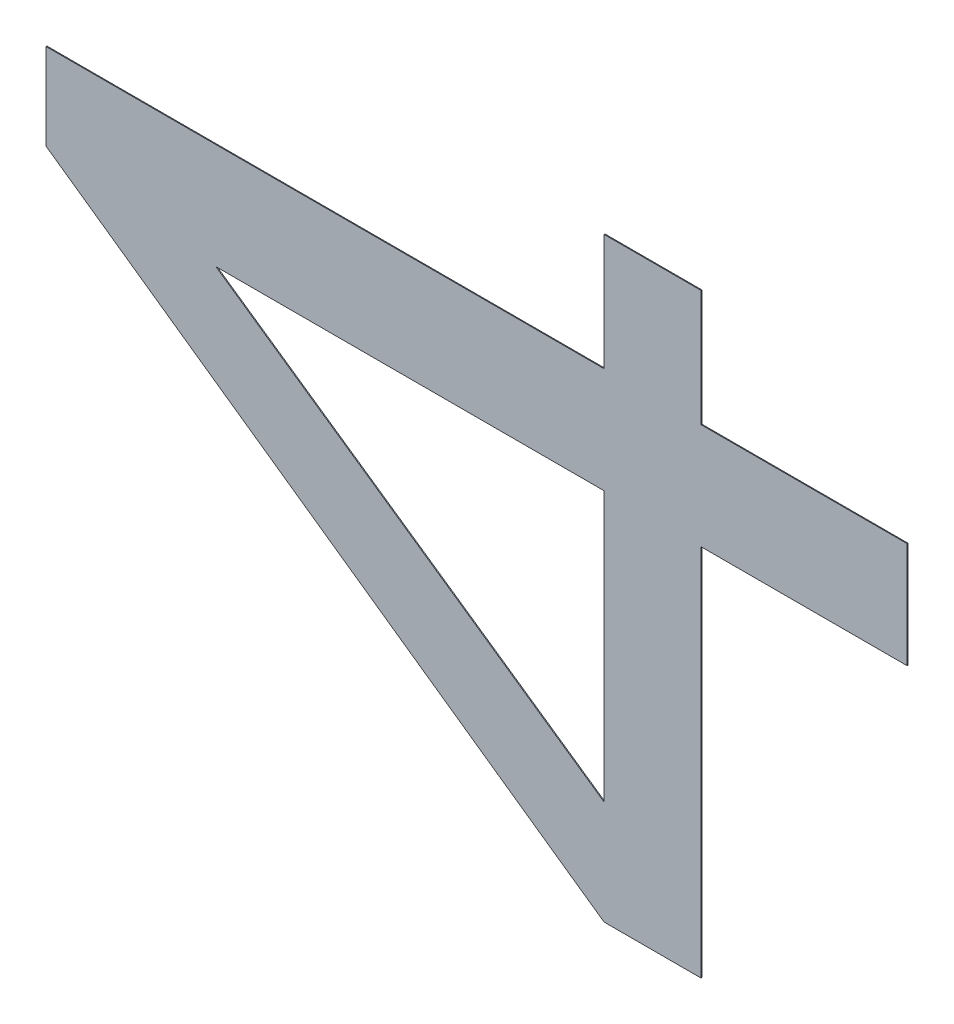
ISO-10303-21;
HEADER;
FILE_DESCRIPTION(('STEP AP214'),'2;1');
FILE_NAME('part.step','',(''),(''),'','','');
FILE_SCHEMA(('AUTOMOTIVE_DESIGN { 1 0 10303 214 1 1 1 1 }'));
ENDSEC;
DATA;
#1=APPLICATION_CONTEXT('core data for automotive mechanical design processes');
#2=APPLICATION_PROTOCOL_DEFINITION('international standard','automotive_design',2000,#1);
#3=PRODUCT_CONTEXT('',#1,'mechanical');
#4=PRODUCT('Part','Part','',(#3));
#5=PRODUCT_RELATED_PRODUCT_CATEGORY('part','',(#4));
#6=PRODUCT_DEFINITION_FORMATION('','',#4);
#7=PRODUCT_DEFINITION_CONTEXT('part definition',#1,'design');
#8=PRODUCT_DEFINITION('design','',#6,#7);
#9=PRODUCT_DEFINITION_SHAPE('','',#8);
#10=(LENGTH_UNIT() NAMED_UNIT(*) SI_UNIT(.MILLI.,.METRE.));
#11=(NAMED_UNIT(*) PLANE_ANGLE_UNIT() SI_UNIT($,.RADIAN.));
#12=(NAMED_UNIT(*) SI_UNIT($,.STERADIAN.) SOLID_ANGLE_UNIT());
#13=UNCERTAINTY_MEASURE_WITH_UNIT(LENGTH_MEASURE(1.E-05),#10,'distance_accuracy_value','');
#14=(GEOMETRIC_REPRESENTATION_CONTEXT(3) GLOBAL_UNCERTAINTY_ASSIGNED_CONTEXT((#13)) GLOBAL_UNIT_ASSIGNED_CONTEXT((#10,
#11,#12)) REPRESENTATION_CONTEXT('',''));
#15=CARTESIAN_POINT('',(0.,0.,0.));
#16=DIRECTION('',(0.,0.,1.));
#17=DIRECTION('',(1.,0.,0.));
#18=AXIS2_PLACEMENT_3D('',#15,#16,#17);
#19=CARTESIAN_POINT('',(100.494516063024,-44.7015960712095,0.002));
#20=DIRECTION('',(0.,1.,0.));
#21=DIRECTION('',(0.,0.,1.));
#22=AXIS2_PLACEMENT_3D('',#19,#20,#21);
#23=PLANE('',#22);
#24=CARTESIAN_POINT('',(100.494516063024,-44.7015960712095,0.));
#25=CARTESIAN_POINT('',(100.795041265944,-44.7015960712095,0.));
#26=CARTESIAN_POINT('',(101.095566468863,-44.7015960712095,0.));
#27=CARTESIAN_POINT('',(101.396091671782,-44.7015960712095,0.));
#28=B_SPLINE_CURVE_WITH_KNOTS('',3,(#24,#25,#26,#27),.UNSPECIFIED.,.F.,.F.,(4,4),(0.,
0.343404044009096),.UNSPECIFIED.);
#29=CARTESIAN_POINT('',(100.494516063024,-44.7015960712095,0.));
#30=VERTEX_POINT('',#29);
#31=CARTESIAN_POINT('',(101.396091671782,-44.7015960712095,0.));
#32=VERTEX_POINT('',#31);
#33=EDGE_CURVE('E125',#30,#32,#28,.T.);
#34=ORIENTED_EDGE('',*,*,#33,.T.);
#35=DIRECTION('',(0.,0.,-1.));
#36=VECTOR('',#35,1.);
#37=CARTESIAN_POINT('',(101.396091671782,-44.7015960712095,0.002));
#38=LINE('',#37,#36);
#39=CARTESIAN_POINT('',(101.396091671782,-44.7015960712095,0.002));
#40=VERTEX_POINT('',#39);
#41=EDGE_CURVE('E132',#40,#32,#38,.T.);
#42=ORIENTED_EDGE('',*,*,#41,.F.);
#43=CARTESIAN_POINT('',(100.494516063024,-44.7015960712095,0.002));
#44=CARTESIAN_POINT('',(100.795041265944,-44.7015960712095,0.002));
#45=CARTESIAN_POINT('',(101.095566468863,-44.7015960712095,0.002));
#46=CARTESIAN_POINT('',(101.396091671782,-44.7015960712095,0.002));
#47=B_SPLINE_CURVE_WITH_KNOTS('',3,(#43,#44,#45,#46),.UNSPECIFIED.,.F.,.F.,(4,4),(0.,
0.343404044009096),.UNSPECIFIED.);
#48=CARTESIAN_POINT('',(100.494516063024,-44.7015960712095,0.002));
#49=VERTEX_POINT('',#48);
#50=EDGE_CURVE('E137',#49,#40,#47,.T.);
#51=ORIENTED_EDGE('',*,*,#50,.F.);
#52=DIRECTION('',(0.,0.,-1.));
#53=VECTOR('',#52,1.);
#54=CARTESIAN_POINT('',(100.494516063024,-44.7015960712095,0.002));
#55=LINE('',#54,#53);
#56=EDGE_CURVE('E129',#49,#30,#55,.T.);
#57=ORIENTED_EDGE('',*,*,#56,.T.);
#58=EDGE_LOOP('',(#34,#42,#51,#57));
#59=FACE_BOUND('',#58,.T.);
#60=ADVANCED_FACE('F17',(#59),#23,.F.);
#61=CARTESIAN_POINT('',(101.396091671782,-44.7015960712095,0.002));
#62=DIRECTION('',(1.,0.,0.));
#63=DIRECTION('',(0.,0.,-1.));
#64=AXIS2_PLACEMENT_3D('',#61,#62,#63);
#65=PLANE('',#64);
#66=CARTESIAN_POINT('',(101.396091671782,-44.7015960712095,0.));
#67=CARTESIAN_POINT('',(101.396091671782,-44.9103130755066,0.));
#68=CARTESIAN_POINT('',(101.396091671782,-45.1190300798037,0.));
#69=CARTESIAN_POINT('',(101.396091671782,-45.3277470841008,0.));
#70=B_SPLINE_CURVE_WITH_KNOTS('',3,(#66,#67,#68,#69),.UNSPECIFIED.,.F.,.F.,(4,4),
(0.343404044009096,0.581900724596439),.UNSPECIFIED.);
#71=CARTESIAN_POINT('',(101.396091671782,-45.3277470841008,0.));
#72=VERTEX_POINT('',#71);
#73=EDGE_CURVE('E123',#32,#72,#70,.T.);
#74=ORIENTED_EDGE('',*,*,#73,.T.);
#75=DIRECTION('',(0.,0.,-1.));
#76=VECTOR('',#75,1.);
#77=CARTESIAN_POINT('',(101.396091671782,-45.3277470841008,0.002));
#78=LINE('',#77,#76);
#79=CARTESIAN_POINT('',(101.396091671782,-45.3277470841008,0.002));
#80=VERTEX_POINT('',#79);
#81=EDGE_CURVE('E128',#80,#72,#78,.T.);
#82=ORIENTED_EDGE('',*,*,#81,.F.);
#83=CARTESIAN_POINT('',(101.396091671782,-44.7015960712095,0.002));
#84=CARTESIAN_POINT('',(101.396091671782,-44.9103130755066,0.002));
#85=CARTESIAN_POINT('',(101.396091671782,-45.1190300798037,0.002));
#86=CARTESIAN_POINT('',(101.396091671782,-45.3277470841008,0.002));
#87=B_SPLINE_CURVE_WITH_KNOTS('',3,(#83,#84,#85,#86),.UNSPECIFIED.,.F.,.F.,(4,4),
(0.343404044009096,0.581900724596439),.UNSPECIFIED.);
#88=EDGE_CURVE('E117',#40,#80,#87,.T.);
#89=ORIENTED_EDGE('',*,*,#88,.F.);
#90=ORIENTED_EDGE('',*,*,#41,.T.);
#91=EDGE_LOOP('',(#74,#82,#89,#90));
#92=FACE_BOUND('',#91,.T.);
#93=ADVANCED_FACE('F133',(#92),#65,.F.);
#94=CARTESIAN_POINT('',(101.621178637201,-44.7015960712095,0.002));
#95=DIRECTION('',(0.,1.,0.));
#96=DIRECTION('',(0.,0.,1.));
#97=AXIS2_PLACEMENT_3D('',#94,#95,#96);
#98=PLANE('',#97);
#99=CARTESIAN_POINT('',(101.621178637201,-44.7015960712095,0.));
#100=CARTESIAN_POINT('',(101.780785758134,-44.7015960712095,0.));
#101=CARTESIAN_POINT('',(101.940392879067,-44.7015960712095,0.));
#102=CARTESIAN_POINT('',(102.1,-44.7015960712095,0.));
#103=B_SPLINE_CURVE_WITH_KNOTS('',3,(#99,#100,#101,#102),.UNSPECIFIED.,.F.,.F.,(4,4),(0.,
0.0779462514461247),.UNSPECIFIED.);
#104=CARTESIAN_POINT('',(101.621178637201,-44.7015960712095,0.));
#105=VERTEX_POINT('',#104);
#106=CARTESIAN_POINT('',(102.1,-44.7015960712095,0.));
#107=VERTEX_POINT('',#106);
#108=EDGE_CURVE('E175',#105,#107,#103,.T.);
#109=ORIENTED_EDGE('',*,*,#108,.T.);
#110=DIRECTION('',(0.,0.,-1.));
#111=VECTOR('',#110,1.);
#112=CARTESIAN_POINT('',(102.1,-44.7015960712095,0.002));
#113=LINE('',#112,#111);
#114=CARTESIAN_POINT('',(102.1,-44.7015960712095,0.002));
#115=VERTEX_POINT('',#114);
#116=EDGE_CURVE('E186',#115,#107,#113,.T.);
#117=ORIENTED_EDGE('',*,*,#116,.F.);
#118=CARTESIAN_POINT('',(101.621178637201,-44.7015960712095,0.002));
#119=CARTESIAN_POINT('',(101.780785758134,-44.7015960712095,0.002));
#120=CARTESIAN_POINT('',(101.940392879067,-44.7015960712095,0.002));
#121=CARTESIAN_POINT('',(102.1,-44.7015960712095,0.002));
#122=B_SPLINE_CURVE_WITH_KNOTS('',3,(#118,#119,#120,#121),.UNSPECIFIED.,.F.,.F.,(4,4),(0.,
0.0779462514461247),.UNSPECIFIED.);
#123=CARTESIAN_POINT('',(101.621178637201,-44.7015960712095,0.002));
#124=VERTEX_POINT('',#123);
#125=EDGE_CURVE('E190',#124,#115,#122,.T.);
#126=ORIENTED_EDGE('',*,*,#125,.F.);
#127=DIRECTION('',(0.,0.,-1.));
#128=VECTOR('',#127,1.);
#129=CARTESIAN_POINT('',(101.621178637201,-44.7015960712095,0.002));
#130=LINE('',#129,#128);
#131=EDGE_CURVE('E201',#124,#105,#130,.T.);
#132=ORIENTED_EDGE('',*,*,#131,.T.);
#133=EDGE_LOOP('',(#109,#117,#126,#132));
#134=FACE_BOUND('',#133,.T.);
#135=ADVANCED_FACE('F476',(#134),#98,.F.);
#136=CARTESIAN_POINT('',(102.1,-44.7015960712095,0.002));
#137=DIRECTION('',(-1.,0.,0.));
#138=DIRECTION('',(0.,0.,1.));
#139=AXIS2_PLACEMENT_3D('',#136,#137,#138);
#140=PLANE('',#139);
#141=CARTESIAN_POINT('',(102.1,-44.7015960712095,0.));
#142=CARTESIAN_POINT('',(102.1,-44.6197462656027,0.));
#143=CARTESIAN_POINT('',(102.1,-44.537896459996,0.));
#144=CARTESIAN_POINT('',(102.1,-44.4560466543893,0.));
#145=B_SPLINE_CURVE_WITH_KNOTS('',3,(#141,#142,#143,#144),.UNSPECIFIED.,.F.,.F.,(4,4),
(0.0779462514461247,0.117918688085163),.UNSPECIFIED.);
#146=CARTESIAN_POINT('',(102.1,-44.4560466543893,0.));
#147=VERTEX_POINT('',#146);
#148=EDGE_CURVE('E205',#107,#147,#145,.T.);
#149=ORIENTED_EDGE('',*,*,#148,.T.);
#150=DIRECTION('',(0.,0.,-1.));
#151=VECTOR('',#150,1.);
#152=CARTESIAN_POINT('',(102.1,-44.4560466543893,0.002));
#153=LINE('',#152,#151);
#154=CARTESIAN_POINT('',(102.1,-44.4560466543893,0.002));
#155=VERTEX_POINT('',#154);
#156=EDGE_CURVE('E215',#155,#147,#153,.T.);
#157=ORIENTED_EDGE('',*,*,#156,.F.);
#158=CARTESIAN_POINT('',(102.1,-44.7015960712095,0.002));
#159=CARTESIAN_POINT('',(102.1,-44.6197462656027,0.002));
#160=CARTESIAN_POINT('',(102.1,-44.537896459996,0.002));
#161=CARTESIAN_POINT('',(102.1,-44.4560466543893,0.002));
#162=B_SPLINE_CURVE_WITH_KNOTS('',3,(#158,#159,#160,#161),.UNSPECIFIED.,.F.,.F.,(4,4),
(0.0779462514461247,0.117918688085163),.UNSPECIFIED.);
#163=EDGE_CURVE('E219',#115,#155,#162,.T.);
#164=ORIENTED_EDGE('',*,*,#163,.F.);
#165=ORIENTED_EDGE('',*,*,#116,.T.);
#166=EDGE_LOOP('',(#149,#157,#164,#165));
#167=FACE_BOUND('',#166,.T.);
#168=ADVANCED_FACE('F481',(#167),#140,.F.);
#169=CARTESIAN_POINT('',(102.1,-44.4560466543893,0.002));
#170=DIRECTION('',(0.,-1.,0.));
#171=DIRECTION('',(0.,0.,-1.));
#172=AXIS2_PLACEMENT_3D('',#169,#170,#171);
#173=PLANE('',#172);
#174=CARTESIAN_POINT('',(102.1,-44.4560466543893,0.));
#175=CARTESIAN_POINT('',(101.940392879067,-44.4560466543893,0.));
#176=CARTESIAN_POINT('',(101.780785758134,-44.4560466543893,0.));
#177=CARTESIAN_POINT('',(101.621178637201,-44.4560466543893,0.));
#178=B_SPLINE_CURVE_WITH_KNOTS('',3,(#174,#175,#176,#177),.UNSPECIFIED.,.F.,.F.,(4,4),
(0.117918688085163,0.195864939531288),.UNSPECIFIED.);
#179=CARTESIAN_POINT('',(101.621178637201,-44.4560466543893,0.));
#180=VERTEX_POINT('',#179);
#181=EDGE_CURVE('E229',#147,#180,#178,.T.);
#182=ORIENTED_EDGE('',*,*,#181,.T.);
#183=DIRECTION('',(0.,0.,-1.));
#184=VECTOR('',#183,1.);
#185=CARTESIAN_POINT('',(101.621178637201,-44.4560466543893,0.002));
#186=LINE('',#185,#184);
#187=CARTESIAN_POINT('',(101.621178637201,-44.4560466543893,0.002));
#188=VERTEX_POINT('',#187);
#189=EDGE_CURVE('E239',#188,#180,#186,.T.);
#190=ORIENTED_EDGE('',*,*,#189,.F.);
#191=CARTESIAN_POINT('',(102.1,-44.4560466543893,0.002));
#192=CARTESIAN_POINT('',(101.940392879067,-44.4560466543893,0.002));
#193=CARTESIAN_POINT('',(101.780785758134,-44.4560466543893,0.002));
#194=CARTESIAN_POINT('',(101.621178637201,-44.4560466543893,0.002));
#195=B_SPLINE_CURVE_WITH_KNOTS('',3,(#191,#192,#193,#194),.UNSPECIFIED.,.F.,.F.,(4,4),
(0.117918688085163,0.195864939531288),.UNSPECIFIED.);
#196=EDGE_CURVE('E243',#155,#188,#195,.T.);
#197=ORIENTED_EDGE('',*,*,#196,.F.);
#198=ORIENTED_EDGE('',*,*,#156,.T.);
#199=EDGE_LOOP('',(#182,#190,#197,#198));
#200=FACE_BOUND('',#199,.T.);
#201=ADVANCED_FACE('F485',(#200),#173,.F.);
#202=CARTESIAN_POINT('',(101.621178637201,-44.4560466543893,0.002));
#203=DIRECTION('',(-1.,0.,0.));
#204=DIRECTION('',(0.,0.,1.));
#205=AXIS2_PLACEMENT_3D('',#202,#203,#204);
#206=PLANE('',#205);
#207=CARTESIAN_POINT('',(101.621178637201,-44.4560466543893,0.));
#208=CARTESIAN_POINT('',(101.621178637201,-44.3660118682219,0.));
#209=CARTESIAN_POINT('',(101.621178637201,-44.2759770820546,0.));
#210=CARTESIAN_POINT('',(101.621178637201,-44.1859422958872,0.));
#211=B_SPLINE_CURVE_WITH_KNOTS('',3,(#207,#208,#209,#210),.UNSPECIFIED.,.F.,.F.,(4,4),
(0.195864939531288,0.239834619834229),.UNSPECIFIED.);
#212=CARTESIAN_POINT('',(101.621178637201,-44.1859422958872,0.));
#213=VERTEX_POINT('',#212);
#214=EDGE_CURVE('E253',#180,#213,#211,.T.);
#215=ORIENTED_EDGE('',*,*,#214,.T.);
#216=DIRECTION('',(0.,0.,-1.));
#217=VECTOR('',#216,1.);
#218=CARTESIAN_POINT('',(101.621178637201,-44.1859422958872,0.002));
#219=LINE('',#218,#217);
#220=CARTESIAN_POINT('',(101.621178637201,-44.1859422958872,0.002));
#221=VERTEX_POINT('',#220);
#222=EDGE_CURVE('E263',#221,#213,#219,.T.);
#223=ORIENTED_EDGE('',*,*,#222,.F.);
#224=CARTESIAN_POINT('',(101.621178637201,-44.4560466543893,0.002));
#225=CARTESIAN_POINT('',(101.621178637201,-44.3660118682219,0.002));
#226=CARTESIAN_POINT('',(101.621178637201,-44.2759770820546,0.002));
#227=CARTESIAN_POINT('',(101.621178637201,-44.1859422958872,0.002));
#228=B_SPLINE_CURVE_WITH_KNOTS('',3,(#224,#225,#226,#227),.UNSPECIFIED.,.F.,.F.,(4,4),
(0.195864939531288,0.239834619834229),.UNSPECIFIED.);
#229=EDGE_CURVE('E267',#188,#221,#228,.T.);
#230=ORIENTED_EDGE('',*,*,#229,.F.);
#231=ORIENTED_EDGE('',*,*,#189,.T.);
#232=EDGE_LOOP('',(#215,#223,#230,#231));
#233=FACE_BOUND('',#232,.T.);
#234=ADVANCED_FACE('F489',(#233),#206,.F.);
#235=CARTESIAN_POINT('',(101.621178637201,-44.1859422958872,0.002));
#236=DIRECTION('',(0.,-1.,0.));
#237=DIRECTION('',(0.,0.,-1.));
#238=AXIS2_PLACEMENT_3D('',#235,#236,#237);
#239=PLANE('',#238);
#240=CARTESIAN_POINT('',(101.621178637201,-44.1859422958872,0.));
#241=CARTESIAN_POINT('',(101.546149648728,-44.1859422958872,0.));
#242=CARTESIAN_POINT('',(101.471120660255,-44.1859422958872,0.));
#243=CARTESIAN_POINT('',(101.396091671782,-44.1859422958872,0.));
#244=B_SPLINE_CURVE_WITH_KNOTS('',3,(#240,#241,#242,#243),.UNSPECIFIED.,.F.,.F.,(4,4),
(0.239834619834229,0.27647602008668),.UNSPECIFIED.);
#245=CARTESIAN_POINT('',(101.396091671782,-44.1859422958872,0.));
#246=VERTEX_POINT('',#245);
#247=EDGE_CURVE('E277',#213,#246,#244,.T.);
#248=ORIENTED_EDGE('',*,*,#247,.T.);
#249=DIRECTION('',(0.,0.,-1.));
#250=VECTOR('',#249,1.);
#251=CARTESIAN_POINT('',(101.396091671782,-44.1859422958872,0.002));
#252=LINE('',#251,#250);
#253=CARTESIAN_POINT('',(101.396091671782,-44.1859422958872,0.002));
#254=VERTEX_POINT('',#253);
#255=EDGE_CURVE('E287',#254,#246,#252,.T.);
#256=ORIENTED_EDGE('',*,*,#255,.F.);
#257=CARTESIAN_POINT('',(101.621178637201,-44.1859422958872,0.002));
#258=CARTESIAN_POINT('',(101.546149648728,-44.1859422958872,0.002));
#259=CARTESIAN_POINT('',(101.471120660255,-44.1859422958872,0.002));
#260=CARTESIAN_POINT('',(101.396091671782,-44.1859422958872,0.002));
#261=B_SPLINE_CURVE_WITH_KNOTS('',3,(#257,#258,#259,#260),.UNSPECIFIED.,.F.,.F.,(4,4),
(0.239834619834229,0.27647602008668),.UNSPECIFIED.);
#262=EDGE_CURVE('E291',#221,#254,#261,.T.);
#263=ORIENTED_EDGE('',*,*,#262,.F.);
#264=ORIENTED_EDGE('',*,*,#222,.T.);
#265=EDGE_LOOP('',(#248,#256,#263,#264));
#266=FACE_BOUND('',#265,.T.);
#267=ADVANCED_FACE('F493',(#266),#239,.F.);
#268=CARTESIAN_POINT('',(101.396091671782,-44.1859422958872,0.002));
#269=DIRECTION('',(1.,0.,0.));
#270=DIRECTION('',(0.,0.,-1.));
#271=AXIS2_PLACEMENT_3D('',#268,#269,#270);
#272=PLANE('',#271);
#273=CARTESIAN_POINT('',(101.396091671782,-44.1859422958872,0.));
#274=CARTESIAN_POINT('',(101.396091671782,-44.2759770820546,0.));
#275=CARTESIAN_POINT('',(101.396091671782,-44.3660118682219,0.));
#276=CARTESIAN_POINT('',(101.396091671782,-44.4560466543893,0.));
#277=B_SPLINE_CURVE_WITH_KNOTS('',3,(#273,#274,#275,#276),.UNSPECIFIED.,.F.,.F.,(4,4),
(0.27647602008668,0.320445700389623),.UNSPECIFIED.);
#278=CARTESIAN_POINT('',(101.396091671782,-44.4560466543893,0.));
#279=VERTEX_POINT('',#278);
#280=EDGE_CURVE('E301',#246,#279,#277,.T.);
#281=ORIENTED_EDGE('',*,*,#280,.T.);
#282=DIRECTION('',(0.,0.,-1.));
#283=VECTOR('',#282,1.);
#284=CARTESIAN_POINT('',(101.396091671782,-44.4560466543893,0.002));
#285=LINE('',#284,#283);
#286=CARTESIAN_POINT('',(101.396091671782,-44.4560466543893,0.002));
#287=VERTEX_POINT('',#286);
#288=EDGE_CURVE('E311',#287,#279,#285,.T.);
#289=ORIENTED_EDGE('',*,*,#288,.F.);
#290=CARTESIAN_POINT('',(101.396091671782,-44.1859422958872,0.002));
#291=CARTESIAN_POINT('',(101.396091671782,-44.2759770820546,0.002));
#292=CARTESIAN_POINT('',(101.396091671782,-44.3660118682219,0.002));
#293=CARTESIAN_POINT('',(101.396091671782,-44.4560466543893,0.002));
#294=B_SPLINE_CURVE_WITH_KNOTS('',3,(#290,#291,#292,#293),.UNSPECIFIED.,.F.,.F.,(4,4),
(0.27647602008668,0.320445700389623),.UNSPECIFIED.);
#295=EDGE_CURVE('E315',#254,#287,#294,.T.);
#296=ORIENTED_EDGE('',*,*,#295,.F.);
#297=ORIENTED_EDGE('',*,*,#255,.T.);
#298=EDGE_LOOP('',(#281,#289,#296,#297));
#299=FACE_BOUND('',#298,.T.);
#300=ADVANCED_FACE('F497',(#299),#272,.F.);
#301=CARTESIAN_POINT('',(101.396091671782,-44.4560466543893,0.002));
#302=DIRECTION('',(0.,-1.,0.));
#303=DIRECTION('',(0.,0.,-1.));
#304=AXIS2_PLACEMENT_3D('',#301,#302,#303);
#305=PLANE('',#304);
#306=CARTESIAN_POINT('',(101.396091671782,-44.4560466543893,0.));
#307=CARTESIAN_POINT('',(100.964061114521,-44.4560466543893,0.));
#308=CARTESIAN_POINT('',(100.532030557261,-44.4560466543893,0.));
#309=CARTESIAN_POINT('',(100.1,-44.4560466543893,0.));
#310=B_SPLINE_CURVE_WITH_KNOTS('',3,(#306,#307,#308,#309),.UNSPECIFIED.,.F.,.F.,(4,4),
(0.320445700389623,0.531433545116012),.UNSPECIFIED.);
#311=CARTESIAN_POINT('',(100.1,-44.4560466543893,0.));
#312=VERTEX_POINT('',#311);
#313=EDGE_CURVE('E325',#279,#312,#310,.T.);
#314=ORIENTED_EDGE('',*,*,#313,.T.);
#315=DIRECTION('',(0.,0.,-1.));
#316=VECTOR('',#315,1.);
#317=CARTESIAN_POINT('',(100.1,-44.4560466543893,0.002));
#318=LINE('',#317,#316);
#319=CARTESIAN_POINT('',(100.1,-44.4560466543893,0.002));
#320=VERTEX_POINT('',#319);
#321=EDGE_CURVE('E335',#320,#312,#318,.T.);
#322=ORIENTED_EDGE('',*,*,#321,.F.);
#323=CARTESIAN_POINT('',(101.396091671782,-44.4560466543893,0.002));
#324=CARTESIAN_POINT('',(100.964061114521,-44.4560466543893,0.002));
#325=CARTESIAN_POINT('',(100.532030557261,-44.4560466543893,0.002));
#326=CARTESIAN_POINT('',(100.1,-44.4560466543893,0.002));
#327=B_SPLINE_CURVE_WITH_KNOTS('',3,(#323,#324,#325,#326),.UNSPECIFIED.,.F.,.F.,(4,4),
(0.320445700389623,0.531433545116012),.UNSPECIFIED.);
#328=EDGE_CURVE('E339',#287,#320,#327,.T.);
#329=ORIENTED_EDGE('',*,*,#328,.F.);
#330=ORIENTED_EDGE('',*,*,#288,.T.);
#331=EDGE_LOOP('',(#314,#322,#329,#330));
#332=FACE_BOUND('',#331,.T.);
#333=ADVANCED_FACE('F501',(#332),#305,.F.);
#334=CARTESIAN_POINT('',(100.1,-44.4560466543893,0.002));
#335=DIRECTION('',(1.,0.,0.));
#336=DIRECTION('',(0.,0.,-1.));
#337=AXIS2_PLACEMENT_3D('',#334,#335,#336);
#338=PLANE('',#337);
#339=CARTESIAN_POINT('',(100.1,-44.4560466543893,0.));
#340=CARTESIAN_POINT('',(100.1,-44.5228906623014,0.));
#341=CARTESIAN_POINT('',(100.1,-44.5897346702136,0.));
#342=CARTESIAN_POINT('',(100.1,-44.6565786781258,0.));
#343=B_SPLINE_CURVE_WITH_KNOTS('',3,(#339,#340,#341,#342),.UNSPECIFIED.,.F.,.F.,(4,4),
(0.531433545116012,0.56407770170456),.UNSPECIFIED.);
#344=CARTESIAN_POINT('',(100.1,-44.6565786781258,0.));
#345=VERTEX_POINT('',#344);
#346=EDGE_CURVE('E349',#312,#345,#343,.T.);
#347=ORIENTED_EDGE('',*,*,#346,.T.);
#348=DIRECTION('',(0.,0.,-1.));
#349=VECTOR('',#348,1.);
#350=CARTESIAN_POINT('',(100.1,-44.6565786781258,0.002));
#351=LINE('',#350,#349);
#352=CARTESIAN_POINT('',(100.1,-44.6565786781258,0.002));
#353=VERTEX_POINT('',#352);
#354=EDGE_CURVE('E359',#353,#345,#351,.T.);
#355=ORIENTED_EDGE('',*,*,#354,.F.);
#356=CARTESIAN_POINT('',(100.1,-44.4560466543893,0.002));
#357=CARTESIAN_POINT('',(100.1,-44.5228906623014,0.002));
#358=CARTESIAN_POINT('',(100.1,-44.5897346702136,0.002));
#359=CARTESIAN_POINT('',(100.1,-44.6565786781258,0.002));
#360=B_SPLINE_CURVE_WITH_KNOTS('',3,(#356,#357,#358,#359),.UNSPECIFIED.,.F.,.F.,(4,4),
(0.531433545116012,0.56407770170456),.UNSPECIFIED.);
#361=EDGE_CURVE('E363',#320,#353,#360,.T.);
#362=ORIENTED_EDGE('',*,*,#361,.F.);
#363=ORIENTED_EDGE('',*,*,#321,.T.);
#364=EDGE_LOOP('',(#347,#355,#362,#363));
#365=FACE_BOUND('',#364,.T.);
#366=ADVANCED_FACE('F505',(#365),#338,.F.);
#367=CARTESIAN_POINT('',(100.1,-44.6565786781258,0.002));
#368=DIRECTION('',(0.575730002924625,0.817639874108651,0.));
#369=DIRECTION('',(-0.817639874108651,0.575730002924626,0.));
#370=AXIS2_PLACEMENT_3D('',#367,#368,#369);
#371=PLANE('',#370);
#372=CARTESIAN_POINT('',(100.1,-44.6565786781258,0.));
#373=CARTESIAN_POINT('',(100.532030557261,-44.9607871222974,0.));
#374=CARTESIAN_POINT('',(100.964061114521,-45.264995566469,0.));
#375=CARTESIAN_POINT('',(101.396091671782,-45.5692040106406,0.));
#376=B_SPLINE_CURVE_WITH_KNOTS('',3,(#372,#373,#374,#375),.UNSPECIFIED.,.F.,.F.,(4,4),
(0.56407770170456,0.822122656956281),.UNSPECIFIED.);
#377=CARTESIAN_POINT('',(101.396091671782,-45.5692040106406,0.));
#378=VERTEX_POINT('',#377);
#379=EDGE_CURVE('E373',#345,#378,#376,.T.);
#380=ORIENTED_EDGE('',*,*,#379,.T.);
#381=DIRECTION('',(0.,0.,-1.));
#382=VECTOR('',#381,1.);
#383=CARTESIAN_POINT('',(101.396091671782,-45.5692040106406,0.002));
#384=LINE('',#383,#382);
#385=CARTESIAN_POINT('',(101.396091671782,-45.5692040106406,0.002));
#386=VERTEX_POINT('',#385);
#387=EDGE_CURVE('E383',#386,#378,#384,.T.);
#388=ORIENTED_EDGE('',*,*,#387,.F.);
#389=CARTESIAN_POINT('',(100.1,-44.6565786781258,0.002));
#390=CARTESIAN_POINT('',(100.532030557261,-44.9607871222974,0.002));
#391=CARTESIAN_POINT('',(100.964061114521,-45.264995566469,0.002));
#392=CARTESIAN_POINT('',(101.396091671782,-45.5692040106406,0.002));
#393=B_SPLINE_CURVE_WITH_KNOTS('',3,(#389,#390,#391,#392),.UNSPECIFIED.,.F.,.F.,(4,4),
(0.56407770170456,0.822122656956281),.UNSPECIFIED.);
#394=EDGE_CURVE('E387',#353,#386,#393,.T.);
#395=ORIENTED_EDGE('',*,*,#394,.F.);
#396=ORIENTED_EDGE('',*,*,#354,.T.);
#397=EDGE_LOOP('',(#380,#388,#395,#396));
#398=FACE_BOUND('',#397,.T.);
#399=ADVANCED_FACE('F509',(#398),#371,.F.);
#400=CARTESIAN_POINT('',(101.396091671782,-45.5692040106406,0.002));
#401=DIRECTION('',(0.,1.,0.));
#402=DIRECTION('',(0.,0.,1.));
#403=AXIS2_PLACEMENT_3D('',#400,#401,#402);
#404=PLANE('',#403);
#405=CARTESIAN_POINT('',(101.396091671782,-45.5692040106406,0.));
#406=CARTESIAN_POINT('',(101.471120660255,-45.5692040106406,0.));
#407=CARTESIAN_POINT('',(101.546149648728,-45.5692040106406,0.));
#408=CARTESIAN_POINT('',(101.621178637201,-45.5692040106406,0.));
#409=B_SPLINE_CURVE_WITH_KNOTS('',3,(#405,#406,#407,#408),.UNSPECIFIED.,.F.,.F.,(4,4),
(0.822122656956281,0.858764057208732),.UNSPECIFIED.);
#410=CARTESIAN_POINT('',(101.621178637201,-45.5692040106406,0.));
#411=VERTEX_POINT('',#410);
#412=EDGE_CURVE('E397',#378,#411,#409,.T.);
#413=ORIENTED_EDGE('',*,*,#412,.T.);
#414=DIRECTION('',(0.,0.,-1.));
#415=VECTOR('',#414,1.);
#416=CARTESIAN_POINT('',(101.621178637201,-45.5692040106406,0.002));
#417=LINE('',#416,#415);
#418=CARTESIAN_POINT('',(101.621178637201,-45.5692040106406,0.002));
#419=VERTEX_POINT('',#418);
#420=EDGE_CURVE('E407',#419,#411,#417,.T.);
#421=ORIENTED_EDGE('',*,*,#420,.F.);
#422=CARTESIAN_POINT('',(101.396091671782,-45.5692040106406,0.002));
#423=CARTESIAN_POINT('',(101.471120660255,-45.5692040106406,0.002));
#424=CARTESIAN_POINT('',(101.546149648728,-45.5692040106406,0.002));
#425=CARTESIAN_POINT('',(101.621178637201,-45.5692040106406,0.002));
#426=B_SPLINE_CURVE_WITH_KNOTS('',3,(#422,#423,#424,#425),.UNSPECIFIED.,.F.,.F.,(4,4),
(0.822122656956281,0.858764057208732),.UNSPECIFIED.);
#427=EDGE_CURVE('E39',#386,#419,#426,.T.);
#428=ORIENTED_EDGE('',*,*,#427,.F.);
#429=ORIENTED_EDGE('',*,*,#387,.T.);
#430=EDGE_LOOP('',(#413,#421,#428,#429));
#431=FACE_BOUND('',#430,.T.);
#432=ADVANCED_FACE('F513',(#431),#404,.F.);
#433=CARTESIAN_POINT('',(101.621178637201,-45.5692040106406,0.002));
#434=DIRECTION('',(-1.,0.,0.));
#435=DIRECTION('',(0.,0.,1.));
#436=AXIS2_PLACEMENT_3D('',#433,#434,#435);
#437=PLANE('',#436);
#438=CARTESIAN_POINT('',(101.621178637201,-45.5692040106406,0.));
#439=CARTESIAN_POINT('',(101.621178637201,-45.2800013641636,0.));
#440=CARTESIAN_POINT('',(101.621178637201,-44.9907987176865,0.));
#441=CARTESIAN_POINT('',(101.621178637201,-44.7015960712095,0.));
#442=B_SPLINE_CURVE_WITH_KNOTS('',3,(#438,#439,#440,#441),.UNSPECIFIED.,.F.,.F.,(4,4),
(0.858764057208732,1.),.UNSPECIFIED.);
#443=EDGE_CURVE('E420',#411,#105,#442,.T.);
#444=ORIENTED_EDGE('',*,*,#443,.T.);
#445=ORIENTED_EDGE('',*,*,#131,.F.);
#446=CARTESIAN_POINT('',(101.621178637201,-45.5692040106406,0.002));
#447=CARTESIAN_POINT('',(101.621178637201,-45.2800013641636,0.002));
#448=CARTESIAN_POINT('',(101.621178637201,-44.9907987176865,0.002));
#449=CARTESIAN_POINT('',(101.621178637201,-44.7015960712095,0.002));
#450=B_SPLINE_CURVE_WITH_KNOTS('',3,(#446,#447,#448,#449),.UNSPECIFIED.,.F.,.F.,(4,4),
(0.858764057208732,1.),.UNSPECIFIED.);
#451=EDGE_CURVE('E430',#419,#124,#450,.T.);
#452=ORIENTED_EDGE('',*,*,#451,.F.);
#453=ORIENTED_EDGE('',*,*,#420,.T.);
#454=EDGE_LOOP('',(#444,#445,#452,#453));
#455=FACE_BOUND('',#454,.T.);
#456=ADVANCED_FACE('F469',(#455),#437,.F.);
#457=CARTESIAN_POINT('',(101.396091671782,-45.3277470841008,0.002));
#458=DIRECTION('',(-0.570430743648483,-0.821345704743525,0.));
#459=DIRECTION('',(0.821345704743525,-0.570430743648484,0.));
#460=AXIS2_PLACEMENT_3D('',#457,#458,#459);
#461=PLANE('',#460);
#462=CARTESIAN_POINT('',(101.396091671782,-45.3277470841008,0.));
#463=CARTESIAN_POINT('',(101.095566468863,-45.1190300798037,0.));
#464=CARTESIAN_POINT('',(100.795041265944,-44.9103130755066,0.));
#465=CARTESIAN_POINT('',(100.494516063024,-44.7015960712095,0.));
#466=B_SPLINE_CURVE_WITH_KNOTS('',3,(#462,#463,#464,#465),.UNSPECIFIED.,.F.,.F.,(4,4),
(0.581900724596439,1.),.UNSPECIFIED.);
#467=EDGE_CURVE('E30',#72,#30,#466,.T.);
#468=ORIENTED_EDGE('',*,*,#467,.T.);
#469=ORIENTED_EDGE('',*,*,#56,.F.);
#470=CARTESIAN_POINT('',(101.396091671782,-45.3277470841008,0.002));
#471=CARTESIAN_POINT('',(101.095566468863,-45.1190300798037,0.002));
#472=CARTESIAN_POINT('',(100.795041265944,-44.9103130755066,0.002));
#473=CARTESIAN_POINT('',(100.494516063024,-44.7015960712095,0.002));
#474=B_SPLINE_CURVE_WITH_KNOTS('',3,(#470,#471,#472,#473),.UNSPECIFIED.,.F.,.F.,(4,4),
(0.581900724596439,1.),.UNSPECIFIED.);
#475=EDGE_CURVE('E11',#80,#49,#474,.T.);
#476=ORIENTED_EDGE('',*,*,#475,.F.);
#477=ORIENTED_EDGE('',*,*,#81,.T.);
#478=EDGE_LOOP('',(#468,#469,#476,#477));
#479=FACE_BOUND('',#478,.T.);
#480=ADVANCED_FACE('F458',(#479),#461,.F.);
#481=CARTESIAN_POINT('',(101.8605893186,-44.7015960712095,0.002));
#482=DIRECTION('',(0.,0.,-1.));
#483=DIRECTION('',(-1.,0.,0.));
#484=AXIS2_PLACEMENT_3D('',#481,#482,#483);
#485=PLANE('',#484);
#486=ORIENTED_EDGE('',*,*,#125,.T.);
#487=ORIENTED_EDGE('',*,*,#163,.T.);
#488=ORIENTED_EDGE('',*,*,#196,.T.);
#489=ORIENTED_EDGE('',*,*,#229,.T.);
#490=ORIENTED_EDGE('',*,*,#262,.T.);
#491=ORIENTED_EDGE('',*,*,#295,.T.);
#492=ORIENTED_EDGE('',*,*,#328,.T.);
#493=ORIENTED_EDGE('',*,*,#361,.T.);
#494=ORIENTED_EDGE('',*,*,#394,.T.);
#495=ORIENTED_EDGE('',*,*,#427,.T.);
#496=ORIENTED_EDGE('',*,*,#451,.T.);
#497=EDGE_LOOP('',(#486,#487,#488,#489,#490,#491,#492,#493,#494,#495,#496));
#498=FACE_BOUND('',#497,.T.);
#499=ORIENTED_EDGE('',*,*,#50,.T.);
#500=ORIENTED_EDGE('',*,*,#88,.T.);
#501=ORIENTED_EDGE('',*,*,#475,.T.);
#502=EDGE_LOOP('',(#499,#500,#501));
#503=FACE_BOUND('',#502,.T.);
#504=ADVANCED_FACE('F461',(#498,#503),#485,.F.);
#505=CARTESIAN_POINT('',(101.8605893186,-44.7015960712095,0.));
#506=DIRECTION('',(0.,0.,-1.));
#507=DIRECTION('',(-1.,0.,0.));
#508=AXIS2_PLACEMENT_3D('',#505,#506,#507);
#509=PLANE('',#508);
#510=ORIENTED_EDGE('',*,*,#108,.F.);
#511=ORIENTED_EDGE('',*,*,#443,.F.);
#512=ORIENTED_EDGE('',*,*,#412,.F.);
#513=ORIENTED_EDGE('',*,*,#379,.F.);
#514=ORIENTED_EDGE('',*,*,#346,.F.);
#515=ORIENTED_EDGE('',*,*,#313,.F.);
#516=ORIENTED_EDGE('',*,*,#280,.F.);
#517=ORIENTED_EDGE('',*,*,#247,.F.);
#518=ORIENTED_EDGE('',*,*,#214,.F.);
#519=ORIENTED_EDGE('',*,*,#181,.F.);
#520=ORIENTED_EDGE('',*,*,#148,.F.);
#521=EDGE_LOOP('',(#510,#511,#512,#513,#514,#515,#516,#517,#518,#519,#520));
#522=FACE_BOUND('',#521,.T.);
#523=ORIENTED_EDGE('',*,*,#33,.F.);
#524=ORIENTED_EDGE('',*,*,#467,.F.);
#525=ORIENTED_EDGE('',*,*,#73,.F.);
#526=EDGE_LOOP('',(#523,#524,#525));
#527=FACE_BOUND('',#526,.T.);
#528=ADVANCED_FACE('F19',(#522,#527),#509,.T.);
#529=CLOSED_SHELL('',(#60,#93,#135,#168,#201,#234,#267,#300,#333,#366,#399,#432,#456,#480,#504,#528));
#530=MANIFOLD_SOLID_BREP('B1',#529);
#531=ADVANCED_BREP_SHAPE_REPRESENTATION('',(#18,#530),#14);
#532=SHAPE_DEFINITION_REPRESENTATION(#9,#531);
ENDSEC;
END-ISO-10303-21;
